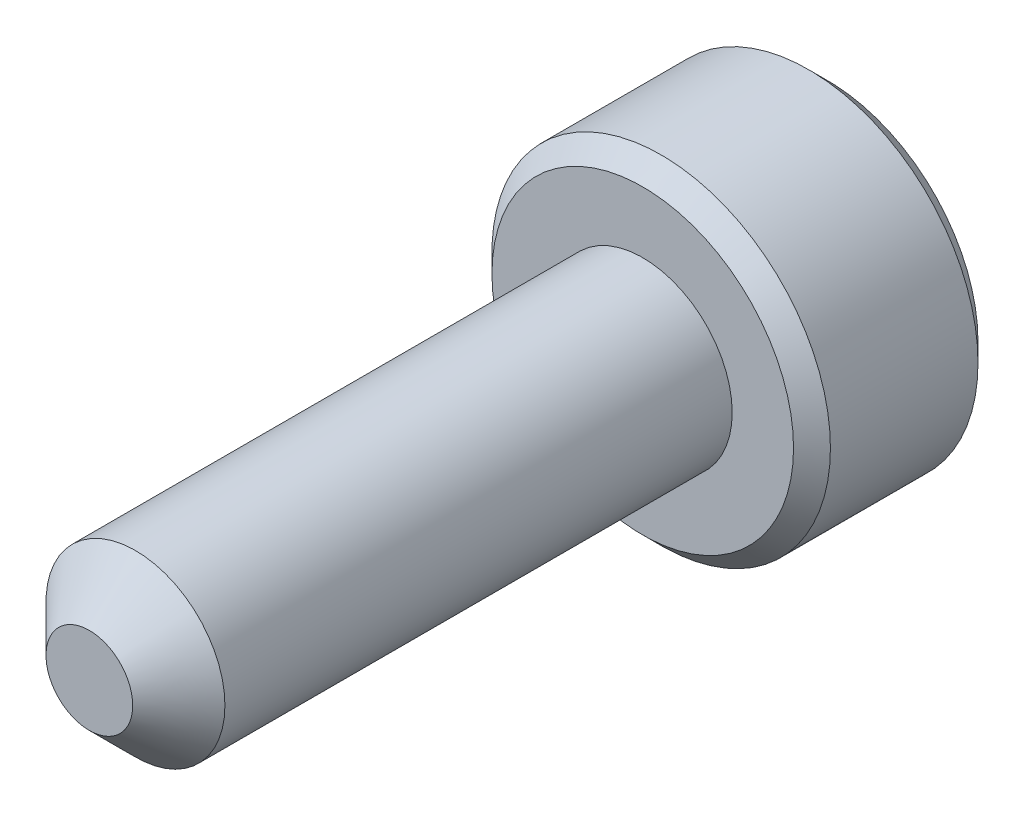
ISO-10303-21;
HEADER;
FILE_DESCRIPTION(('STEP AP214'),'2;1');
FILE_NAME('part.step','',(''),(''),'','','');
FILE_SCHEMA(('AUTOMOTIVE_DESIGN { 1 0 10303 214 1 1 1 1 }'));
ENDSEC;
DATA;
#1=APPLICATION_CONTEXT('core data for automotive mechanical design processes');
#2=APPLICATION_PROTOCOL_DEFINITION('international standard','automotive_design',2000,#1);
#3=PRODUCT_CONTEXT('',#1,'mechanical');
#4=PRODUCT('Part','Part','',(#3));
#5=PRODUCT_RELATED_PRODUCT_CATEGORY('part','',(#4));
#6=PRODUCT_DEFINITION_FORMATION('','',#4);
#7=PRODUCT_DEFINITION_CONTEXT('part definition',#1,'design');
#8=PRODUCT_DEFINITION('design','',#6,#7);
#9=PRODUCT_DEFINITION_SHAPE('','',#8);
#10=(LENGTH_UNIT() NAMED_UNIT(*) SI_UNIT(.MILLI.,.METRE.));
#11=(NAMED_UNIT(*) PLANE_ANGLE_UNIT() SI_UNIT($,.RADIAN.));
#12=(NAMED_UNIT(*) SI_UNIT($,.STERADIAN.) SOLID_ANGLE_UNIT());
#13=UNCERTAINTY_MEASURE_WITH_UNIT(LENGTH_MEASURE(1.E-05),#10,'distance_accuracy_value','');
#14=(GEOMETRIC_REPRESENTATION_CONTEXT(3) GLOBAL_UNCERTAINTY_ASSIGNED_CONTEXT((#13)) GLOBAL_UNIT_ASSIGNED_CONTEXT((#10,
#11,#12)) REPRESENTATION_CONTEXT('',''));
#15=CARTESIAN_POINT('',(0.,0.,0.));
#16=DIRECTION('',(0.,0.,1.));
#17=DIRECTION('',(1.,0.,0.));
#18=AXIS2_PLACEMENT_3D('',#15,#16,#17);
#19=CARTESIAN_POINT('',(0.,0.,2.));
#20=DIRECTION('',(0.,0.,-1.));
#21=DIRECTION('',(-1.,0.,0.));
#22=AXIS2_PLACEMENT_3D('',#19,#20,#21);
#23=CYLINDRICAL_SURFACE('',#22,1.835);
#24=CARTESIAN_POINT('',(0.,0.,1.8));
#25=DIRECTION('',(0.,0.,1.));
#26=DIRECTION('',(1.,0.,0.));
#27=AXIS2_PLACEMENT_3D('',#24,#25,#26);
#28=CIRCLE('',#27,1.835);
#29=CARTESIAN_POINT('',(1.835,0.,1.8));
#30=VERTEX_POINT('',#29);
#31=EDGE_CURVE('E55',#30,#30,#28,.F.);
#32=ORIENTED_EDGE('',*,*,#31,.T.);
#33=EDGE_LOOP('',(#32));
#34=FACE_BOUND('',#33,.T.);
#35=CARTESIAN_POINT('',(0.,0.,0.2));
#36=DIRECTION('',(0.,0.,1.));
#37=DIRECTION('',(1.,0.,0.));
#38=AXIS2_PLACEMENT_3D('',#35,#36,#37);
#39=CIRCLE('',#38,1.835);
#40=CARTESIAN_POINT('',(1.835,0.,0.2));
#41=VERTEX_POINT('',#40);
#42=EDGE_CURVE('E186',#41,#41,#39,.T.);
#43=ORIENTED_EDGE('',*,*,#42,.T.);
#44=EDGE_LOOP('',(#43));
#45=FACE_BOUND('',#44,.T.);
#46=ADVANCED_FACE('F45',(#34,#45),#23,.T.);
#47=CARTESIAN_POINT('',(0.,0.,2.));
#48=DIRECTION('',(0.,0.,1.));
#49=DIRECTION('',(1.,0.,0.));
#50=AXIS2_PLACEMENT_3D('',#47,#48,#49);
#51=PLANE('',#50);
#52=CARTESIAN_POINT('',(0.,0.,2.));
#53=DIRECTION('',(0.,0.,1.));
#54=DIRECTION('',(1.,0.,0.));
#55=AXIS2_PLACEMENT_3D('',#52,#53,#54);
#56=CIRCLE('',#55,1.635);
#57=CARTESIAN_POINT('',(1.635,0.,2.));
#58=VERTEX_POINT('',#57);
#59=EDGE_CURVE('E182',#58,#58,#56,.T.);
#60=ORIENTED_EDGE('',*,*,#59,.T.);
#61=EDGE_LOOP('',(#60));
#62=FACE_BOUND('',#61,.T.);
#63=CARTESIAN_POINT('',(0.,0.,2.));
#64=DIRECTION('',(0.,0.,1.));
#65=DIRECTION('',(1.,0.,0.));
#66=AXIS2_PLACEMENT_3D('',#63,#64,#65);
#67=CIRCLE('',#66,0.97);
#68=CARTESIAN_POINT('',(0.97,0.,2.));
#69=VERTEX_POINT('',#68);
#70=EDGE_CURVE('E161',#69,#69,#67,.T.);
#71=ORIENTED_EDGE('',*,*,#70,.F.);
#72=EDGE_LOOP('',(#71));
#73=FACE_BOUND('',#72,.T.);
#74=ADVANCED_FACE('F200',(#62,#73),#51,.T.);
#75=CARTESIAN_POINT('',(0.,0.,0.));
#76=DIRECTION('',(0.,0.,1.));
#77=DIRECTION('',(1.,0.,0.));
#78=AXIS2_PLACEMENT_3D('',#75,#76,#77);
#79=PLANE('',#78);
#80=CARTESIAN_POINT('',(0.,0.,0.));
#81=DIRECTION('',(0.,0.,1.));
#82=DIRECTION('',(1.,0.,0.));
#83=AXIS2_PLACEMENT_3D('',#80,#81,#82);
#84=CIRCLE('',#83,1.635);
#85=CARTESIAN_POINT('',(1.635,0.,0.));
#86=VERTEX_POINT('',#85);
#87=EDGE_CURVE('E11',#86,#86,#84,.F.);
#88=ORIENTED_EDGE('',*,*,#87,.T.);
#89=EDGE_LOOP('',(#88));
#90=FACE_BOUND('',#89,.T.);
#91=DIRECTION('',(0.500000000000001,0.866025403784438,0.));
#92=VECTOR('',#91,1.);
#93=CARTESIAN_POINT('',(-1.14525122507638,0.,0.));
#94=LINE('',#93,#92);
#95=CARTESIAN_POINT('',(-1.14525122507638,0.,0.));
#96=VERTEX_POINT('',#95);
#97=CARTESIAN_POINT('',(-0.572625612538188,0.991816654631397,0.));
#98=VERTEX_POINT('',#97);
#99=EDGE_CURVE('E142',#96,#98,#94,.T.);
#100=ORIENTED_EDGE('',*,*,#99,.F.);
#101=DIRECTION('',(-0.499999999999995,0.866025403784441,0.));
#102=VECTOR('',#101,1.);
#103=CARTESIAN_POINT('',(-0.572625612538202,-0.991816654631389,0.));
#104=LINE('',#103,#102);
#105=CARTESIAN_POINT('',(-0.572625612538202,-0.991816654631389,0.));
#106=VERTEX_POINT('',#105);
#107=EDGE_CURVE('E62',#106,#96,#104,.T.);
#108=ORIENTED_EDGE('',*,*,#107,.F.);
#109=DIRECTION('',(-1.,0.,0.));
#110=VECTOR('',#109,1.);
#111=CARTESIAN_POINT('',(0.572625612538181,-0.991816654631401,0.));
#112=LINE('',#111,#110);
#113=CARTESIAN_POINT('',(0.572625612538181,-0.991816654631401,0.));
#114=VERTEX_POINT('',#113);
#115=EDGE_CURVE('E155',#114,#106,#112,.T.);
#116=ORIENTED_EDGE('',*,*,#115,.F.);
#117=DIRECTION('',(-0.500000000000007,-0.866025403784435,0.));
#118=VECTOR('',#117,1.);
#119=CARTESIAN_POINT('',(1.14525122507638,0.,0.));
#120=LINE('',#119,#118);
#121=CARTESIAN_POINT('',(1.14525122507638,0.,0.));
#122=VERTEX_POINT('',#121);
#123=EDGE_CURVE('E152',#122,#114,#120,.T.);
#124=ORIENTED_EDGE('',*,*,#123,.F.);
#125=DIRECTION('',(0.499999999999995,-0.866025403784442,0.));
#126=VECTOR('',#125,1.);
#127=CARTESIAN_POINT('',(0.572625612538195,0.991816654631393,0.));
#128=LINE('',#127,#126);
#129=CARTESIAN_POINT('',(0.572625612538195,0.991816654631393,0.));
#130=VERTEX_POINT('',#129);
#131=EDGE_CURVE('E110',#130,#122,#128,.T.);
#132=ORIENTED_EDGE('',*,*,#131,.F.);
#133=DIRECTION('',(1.,0.,0.));
#134=VECTOR('',#133,1.);
#135=CARTESIAN_POINT('',(-0.572625612538188,0.991816654631397,0.));
#136=LINE('',#135,#134);
#137=EDGE_CURVE('E146',#98,#130,#136,.T.);
#138=ORIENTED_EDGE('',*,*,#137,.F.);
#139=EDGE_LOOP('',(#100,#108,#116,#124,#132,#138));
#140=FACE_BOUND('',#139,.T.);
#141=ADVANCED_FACE('F203',(#90,#140),#79,.F.);
#142=CARTESIAN_POINT('',(0.,0.,8.));
#143=DIRECTION('',(0.,0.,-1.));
#144=DIRECTION('',(-1.,0.,0.));
#145=AXIS2_PLACEMENT_3D('',#142,#143,#144);
#146=CYLINDRICAL_SURFACE('',#145,0.97);
#147=CARTESIAN_POINT('',(0.,0.,7.5));
#148=DIRECTION('',(0.,0.,1.));
#149=DIRECTION('',(1.,0.,0.));
#150=AXIS2_PLACEMENT_3D('',#147,#148,#149);
#151=CIRCLE('',#150,0.97);
#152=CARTESIAN_POINT('',(0.97,0.,7.5));
#153=VERTEX_POINT('',#152);
#154=EDGE_CURVE('E178',#153,#153,#151,.F.);
#155=ORIENTED_EDGE('',*,*,#154,.T.);
#156=EDGE_LOOP('',(#155));
#157=FACE_BOUND('',#156,.T.);
#158=ORIENTED_EDGE('',*,*,#70,.T.);
#159=EDGE_LOOP('',(#158));
#160=FACE_BOUND('',#159,.T.);
#161=ADVANCED_FACE('F207',(#157,#160),#146,.T.);
#162=CARTESIAN_POINT('',(0.,0.,8.));
#163=DIRECTION('',(0.,0.,1.));
#164=DIRECTION('',(1.,0.,0.));
#165=AXIS2_PLACEMENT_3D('',#162,#163,#164);
#166=PLANE('',#165);
#167=CARTESIAN_POINT('',(0.,0.,8.));
#168=DIRECTION('',(0.,0.,1.));
#169=DIRECTION('',(1.,0.,0.));
#170=AXIS2_PLACEMENT_3D('',#167,#168,#169);
#171=CIRCLE('',#170,0.469999999999999);
#172=CARTESIAN_POINT('',(0.469999999999999,0.,8.));
#173=VERTEX_POINT('',#172);
#174=EDGE_CURVE('E174',#173,#173,#171,.T.);
#175=ORIENTED_EDGE('',*,*,#174,.T.);
#176=EDGE_LOOP('',(#175));
#177=FACE_BOUND('',#176,.T.);
#178=ADVANCED_FACE('F209',(#177),#166,.T.);
#179=CARTESIAN_POINT('',(0.,0.,8.));
#180=DIRECTION('',(0.,0.,-1.));
#181=DIRECTION('',(-1.,0.,0.));
#182=AXIS2_PLACEMENT_3D('',#179,#180,#181);
#183=CONICAL_SURFACE('',#182,0.469999999999999,0.785398163397446);
#184=ORIENTED_EDGE('',*,*,#154,.F.);
#185=EDGE_LOOP('',(#184));
#186=FACE_BOUND('',#185,.T.);
#187=ORIENTED_EDGE('',*,*,#174,.F.);
#188=EDGE_LOOP('',(#187));
#189=FACE_BOUND('',#188,.T.);
#190=ADVANCED_FACE('F216',(#186,#189),#183,.T.);
#191=CARTESIAN_POINT('',(-0.572625612538202,-0.991816654631389,1.));
#192=DIRECTION('',(-0.866025403784441,-0.499999999999995,0.));
#193=DIRECTION('',(0.499999999999995,-0.866025403784442,0.));
#194=AXIS2_PLACEMENT_3D('',#191,#192,#193);
#195=PLANE('',#194);
#196=ORIENTED_EDGE('',*,*,#107,.T.);
#197=DIRECTION('',(0.,0.,-1.));
#198=VECTOR('',#197,1.);
#199=CARTESIAN_POINT('',(-1.14525122507638,0.,1.));
#200=LINE('',#199,#198);
#201=CARTESIAN_POINT('',(-1.14525122507638,0.,1.));
#202=VERTEX_POINT('',#201);
#203=EDGE_CURVE('E92',#202,#96,#200,.T.);
#204=ORIENTED_EDGE('',*,*,#203,.F.);
#205=DIRECTION('',(-0.499999999999995,0.866025403784441,0.));
#206=VECTOR('',#205,1.);
#207=CARTESIAN_POINT('',(-0.572625612538202,-0.991816654631389,1.));
#208=LINE('',#207,#206);
#209=CARTESIAN_POINT('',(-0.572625612538202,-0.991816654631389,1.));
#210=VERTEX_POINT('',#209);
#211=EDGE_CURVE('E158',#210,#202,#208,.T.);
#212=ORIENTED_EDGE('',*,*,#211,.F.);
#213=DIRECTION('',(0.,0.,-1.));
#214=VECTOR('',#213,1.);
#215=CARTESIAN_POINT('',(-0.572625612538202,-0.991816654631389,1.));
#216=LINE('',#215,#214);
#217=EDGE_CURVE('E70',#210,#106,#216,.T.);
#218=ORIENTED_EDGE('',*,*,#217,.T.);
#219=EDGE_LOOP('',(#196,#204,#212,#218));
#220=FACE_BOUND('',#219,.T.);
#221=ADVANCED_FACE('F231',(#220),#195,.F.);
#222=CARTESIAN_POINT('',(0.572625612538181,-0.991816654631401,1.));
#223=DIRECTION('',(0.,-1.,0.));
#224=DIRECTION('',(1.,0.,0.));
#225=AXIS2_PLACEMENT_3D('',#222,#223,#224);
#226=PLANE('',#225);
#227=ORIENTED_EDGE('',*,*,#115,.T.);
#228=ORIENTED_EDGE('',*,*,#217,.F.);
#229=DIRECTION('',(-1.,0.,0.));
#230=VECTOR('',#229,1.);
#231=CARTESIAN_POINT('',(0.572625612538181,-0.991816654631401,1.));
#232=LINE('',#231,#230);
#233=CARTESIAN_POINT('',(0.572625612538181,-0.991816654631401,1.));
#234=VERTEX_POINT('',#233);
#235=EDGE_CURVE('E124',#234,#210,#232,.T.);
#236=ORIENTED_EDGE('',*,*,#235,.F.);
#237=DIRECTION('',(0.,0.,-1.));
#238=VECTOR('',#237,1.);
#239=CARTESIAN_POINT('',(0.572625612538181,-0.991816654631401,1.));
#240=LINE('',#239,#238);
#241=EDGE_CURVE('E115',#234,#114,#240,.T.);
#242=ORIENTED_EDGE('',*,*,#241,.T.);
#243=EDGE_LOOP('',(#227,#228,#236,#242));
#244=FACE_BOUND('',#243,.T.);
#245=ADVANCED_FACE('F240',(#244),#226,.F.);
#246=CARTESIAN_POINT('',(1.14525122507638,0.,1.));
#247=DIRECTION('',(0.866025403784435,-0.500000000000007,0.));
#248=DIRECTION('',(0.500000000000007,0.866025403784435,0.));
#249=AXIS2_PLACEMENT_3D('',#246,#247,#248);
#250=PLANE('',#249);
#251=ORIENTED_EDGE('',*,*,#123,.T.);
#252=ORIENTED_EDGE('',*,*,#241,.F.);
#253=DIRECTION('',(-0.500000000000007,-0.866025403784435,0.));
#254=VECTOR('',#253,1.);
#255=CARTESIAN_POINT('',(1.14525122507638,0.,1.));
#256=LINE('',#255,#254);
#257=CARTESIAN_POINT('',(1.14525122507638,0.,1.));
#258=VERTEX_POINT('',#257);
#259=EDGE_CURVE('E119',#258,#234,#256,.T.);
#260=ORIENTED_EDGE('',*,*,#259,.F.);
#261=DIRECTION('',(0.,0.,-1.));
#262=VECTOR('',#261,1.);
#263=CARTESIAN_POINT('',(1.14525122507638,0.,1.));
#264=LINE('',#263,#262);
#265=EDGE_CURVE('E103',#258,#122,#264,.T.);
#266=ORIENTED_EDGE('',*,*,#265,.T.);
#267=EDGE_LOOP('',(#251,#252,#260,#266));
#268=FACE_BOUND('',#267,.T.);
#269=ADVANCED_FACE('F120',(#268),#250,.F.);
#270=CARTESIAN_POINT('',(0.572625612538195,0.991816654631393,1.));
#271=DIRECTION('',(0.866025403784442,0.499999999999995,0.));
#272=DIRECTION('',(-0.499999999999995,0.866025403784442,0.));
#273=AXIS2_PLACEMENT_3D('',#270,#271,#272);
#274=PLANE('',#273);
#275=ORIENTED_EDGE('',*,*,#131,.T.);
#276=ORIENTED_EDGE('',*,*,#265,.F.);
#277=DIRECTION('',(0.499999999999995,-0.866025403784442,0.));
#278=VECTOR('',#277,1.);
#279=CARTESIAN_POINT('',(0.572625612538195,0.991816654631393,1.));
#280=LINE('',#279,#278);
#281=CARTESIAN_POINT('',(0.572625612538195,0.991816654631393,1.));
#282=VERTEX_POINT('',#281);
#283=EDGE_CURVE('E107',#282,#258,#280,.T.);
#284=ORIENTED_EDGE('',*,*,#283,.F.);
#285=DIRECTION('',(0.,0.,-1.));
#286=VECTOR('',#285,1.);
#287=CARTESIAN_POINT('',(0.572625612538195,0.991816654631393,1.));
#288=LINE('',#287,#286);
#289=EDGE_CURVE('E116',#282,#130,#288,.T.);
#290=ORIENTED_EDGE('',*,*,#289,.T.);
#291=EDGE_LOOP('',(#275,#276,#284,#290));
#292=FACE_BOUND('',#291,.T.);
#293=ADVANCED_FACE('F105',(#292),#274,.F.);
#294=CARTESIAN_POINT('',(-0.572625612538188,0.991816654631397,1.));
#295=DIRECTION('',(0.,1.,0.));
#296=DIRECTION('',(-1.,0.,0.));
#297=AXIS2_PLACEMENT_3D('',#294,#295,#296);
#298=PLANE('',#297);
#299=ORIENTED_EDGE('',*,*,#137,.T.);
#300=ORIENTED_EDGE('',*,*,#289,.F.);
#301=DIRECTION('',(1.,0.,0.));
#302=VECTOR('',#301,1.);
#303=CARTESIAN_POINT('',(-0.572625612538188,0.991816654631397,1.));
#304=LINE('',#303,#302);
#305=CARTESIAN_POINT('',(-0.572625612538188,0.991816654631397,1.));
#306=VERTEX_POINT('',#305);
#307=EDGE_CURVE('E130',#306,#282,#304,.T.);
#308=ORIENTED_EDGE('',*,*,#307,.F.);
#309=DIRECTION('',(0.,0.,-1.));
#310=VECTOR('',#309,1.);
#311=CARTESIAN_POINT('',(-0.572625612538188,0.991816654631397,1.));
#312=LINE('',#311,#310);
#313=EDGE_CURVE('E166',#306,#98,#312,.T.);
#314=ORIENTED_EDGE('',*,*,#313,.T.);
#315=EDGE_LOOP('',(#299,#300,#308,#314));
#316=FACE_BOUND('',#315,.T.);
#317=ADVANCED_FACE('F253',(#316),#298,.F.);
#318=CARTESIAN_POINT('',(-1.14525122507638,0.,1.));
#319=DIRECTION('',(-0.866025403784438,0.500000000000001,0.));
#320=DIRECTION('',(-0.500000000000001,-0.866025403784438,0.));
#321=AXIS2_PLACEMENT_3D('',#318,#319,#320);
#322=PLANE('',#321);
#323=ORIENTED_EDGE('',*,*,#99,.T.);
#324=ORIENTED_EDGE('',*,*,#313,.F.);
#325=DIRECTION('',(0.500000000000001,0.866025403784438,0.));
#326=VECTOR('',#325,1.);
#327=CARTESIAN_POINT('',(-1.14525122507638,0.,1.));
#328=LINE('',#327,#326);
#329=EDGE_CURVE('E134',#202,#306,#328,.T.);
#330=ORIENTED_EDGE('',*,*,#329,.F.);
#331=ORIENTED_EDGE('',*,*,#203,.T.);
#332=EDGE_LOOP('',(#323,#324,#330,#331));
#333=FACE_BOUND('',#332,.T.);
#334=ADVANCED_FACE('F250',(#333),#322,.F.);
#335=CARTESIAN_POINT('',(0.,0.,1.));
#336=DIRECTION('',(0.,0.,-1.));
#337=DIRECTION('',(-1.,0.,0.));
#338=AXIS2_PLACEMENT_3D('',#335,#336,#337);
#339=PLANE('',#338);
#340=ORIENTED_EDGE('',*,*,#211,.T.);
#341=ORIENTED_EDGE('',*,*,#329,.T.);
#342=ORIENTED_EDGE('',*,*,#307,.T.);
#343=ORIENTED_EDGE('',*,*,#283,.T.);
#344=ORIENTED_EDGE('',*,*,#259,.T.);
#345=ORIENTED_EDGE('',*,*,#235,.T.);
#346=EDGE_LOOP('',(#340,#341,#342,#343,#344,#345));
#347=FACE_BOUND('',#346,.T.);
#348=ADVANCED_FACE('F127',(#347),#339,.T.);
#349=CARTESIAN_POINT('',(0.,0.,2.));
#350=DIRECTION('',(0.,0.,-1.));
#351=DIRECTION('',(-1.,0.,0.));
#352=AXIS2_PLACEMENT_3D('',#349,#350,#351);
#353=CONICAL_SURFACE('',#352,1.635,0.785398163397442);
#354=ORIENTED_EDGE('',*,*,#31,.F.);
#355=EDGE_LOOP('',(#354));
#356=FACE_BOUND('',#355,.T.);
#357=ORIENTED_EDGE('',*,*,#59,.F.);
#358=EDGE_LOOP('',(#357));
#359=FACE_BOUND('',#358,.T.);
#360=ADVANCED_FACE('F195',(#356,#359),#353,.T.);
#361=CARTESIAN_POINT('',(0.,0.,0.2));
#362=DIRECTION('',(0.,0.,1.));
#363=DIRECTION('',(1.,0.,0.));
#364=AXIS2_PLACEMENT_3D('',#361,#362,#363);
#365=CONICAL_SURFACE('',#364,1.835,0.785398163397451);
#366=ORIENTED_EDGE('',*,*,#87,.F.);
#367=EDGE_LOOP('',(#366));
#368=FACE_BOUND('',#367,.T.);
#369=ORIENTED_EDGE('',*,*,#42,.F.);
#370=EDGE_LOOP('',(#369));
#371=FACE_BOUND('',#370,.T.);
#372=ADVANCED_FACE('F48',(#368,#371),#365,.T.);
#373=CLOSED_SHELL('',(#46,#74,#141,#161,#178,#190,#221,#245,#269,#293,#317,#334,#348,#360,#372));
#374=MANIFOLD_SOLID_BREP('B2',#373);
#375=ADVANCED_BREP_SHAPE_REPRESENTATION('',(#18,#374),#14);
#376=SHAPE_DEFINITION_REPRESENTATION(#9,#375);
ENDSEC;
END-ISO-10303-21;
